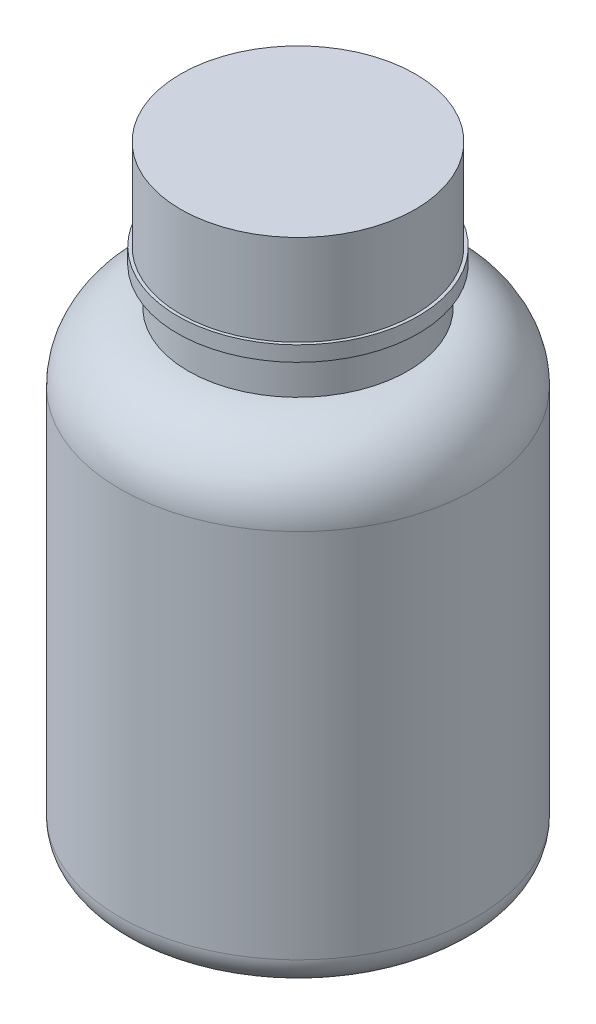
ISO-10303-21;
HEADER;
FILE_DESCRIPTION(('STEP AP214'),'2;1');
FILE_NAME('part.step','',(''),(''),'','','');
FILE_SCHEMA(('AUTOMOTIVE_DESIGN { 1 0 10303 214 1 1 1 1 }'));
ENDSEC;
DATA;
#1=APPLICATION_CONTEXT('core data for automotive mechanical design processes');
#2=APPLICATION_PROTOCOL_DEFINITION('international standard','automotive_design',2000,#1);
#3=PRODUCT_CONTEXT('',#1,'mechanical');
#4=PRODUCT('Part','Part','',(#3));
#5=PRODUCT_RELATED_PRODUCT_CATEGORY('part','',(#4));
#6=PRODUCT_DEFINITION_FORMATION('','',#4);
#7=PRODUCT_DEFINITION_CONTEXT('part definition',#1,'design');
#8=PRODUCT_DEFINITION('design','',#6,#7);
#9=PRODUCT_DEFINITION_SHAPE('','',#8);
#10=(LENGTH_UNIT() NAMED_UNIT(*) SI_UNIT(.MILLI.,.METRE.));
#11=(NAMED_UNIT(*) PLANE_ANGLE_UNIT() SI_UNIT($,.RADIAN.));
#12=(NAMED_UNIT(*) SI_UNIT($,.STERADIAN.) SOLID_ANGLE_UNIT());
#13=UNCERTAINTY_MEASURE_WITH_UNIT(LENGTH_MEASURE(1.E-05),#10,'distance_accuracy_value','');
#14=(GEOMETRIC_REPRESENTATION_CONTEXT(3) GLOBAL_UNCERTAINTY_ASSIGNED_CONTEXT((#13)) GLOBAL_UNIT_ASSIGNED_CONTEXT((#10,
#11,#12)) REPRESENTATION_CONTEXT('',''));
#15=CARTESIAN_POINT('',(0.,0.,0.));
#16=DIRECTION('',(0.,0.,1.));
#17=DIRECTION('',(1.,0.,0.));
#18=AXIS2_PLACEMENT_3D('',#15,#16,#17);
#19=CARTESIAN_POINT('',(0.,28.,0.));
#20=DIRECTION('',(0.,-1.,0.));
#21=DIRECTION('',(0.,0.,-1.));
#22=AXIS2_PLACEMENT_3D('',#19,#20,#21);
#23=TOROIDAL_SURFACE('',#22,14.5,9.);
#24=CARTESIAN_POINT('',(0.,27.9999999999999,0.));
#25=DIRECTION('',(0.,-1.,0.));
#26=DIRECTION('',(0.,0.,-1.));
#27=AXIS2_PLACEMENT_3D('',#24,#25,#26);
#28=CIRCLE('',#27,23.5);
#29=CARTESIAN_POINT('',(0.,27.9999999999999,-23.5));
#30=VERTEX_POINT('',#29);
#31=EDGE_CURVE('E66',#30,#30,#28,.T.);
#32=ORIENTED_EDGE('',*,*,#31,.F.);
#33=EDGE_LOOP('',(#32));
#34=FACE_BOUND('',#33,.T.);
#35=CARTESIAN_POINT('',(0.,37.,0.));
#36=DIRECTION('',(0.,-1.,0.));
#37=DIRECTION('',(0.,0.,-1.));
#38=AXIS2_PLACEMENT_3D('',#35,#36,#37);
#39=CIRCLE('',#38,14.4999999999999);
#40=CARTESIAN_POINT('',(0.,37.,-14.4999999999999));
#41=VERTEX_POINT('',#40);
#42=EDGE_CURVE('E10',#41,#41,#39,.T.);
#43=ORIENTED_EDGE('',*,*,#42,.T.);
#44=EDGE_LOOP('',(#43));
#45=FACE_BOUND('',#44,.T.);
#46=ADVANCED_FACE('F35',(#34,#45),#23,.T.);
#47=CARTESIAN_POINT('',(0.,0.,0.));
#48=DIRECTION('',(0.,-1.,0.));
#49=DIRECTION('',(0.,0.,-1.));
#50=AXIS2_PLACEMENT_3D('',#47,#48,#49);
#51=CYLINDRICAL_SURFACE('',#50,14.4999999999999);
#52=ORIENTED_EDGE('',*,*,#42,.F.);
#53=EDGE_LOOP('',(#52));
#54=FACE_BOUND('',#53,.T.);
#55=CARTESIAN_POINT('',(0.,42.,0.));
#56=DIRECTION('',(0.,-1.,0.));
#57=DIRECTION('',(0.,0.,-1.));
#58=AXIS2_PLACEMENT_3D('',#55,#56,#57);
#59=CIRCLE('',#58,14.4999999999999);
#60=CARTESIAN_POINT('',(0.,42.,-14.4999999999999));
#61=VERTEX_POINT('',#60);
#62=EDGE_CURVE('E41',#61,#61,#59,.T.);
#63=ORIENTED_EDGE('',*,*,#62,.T.);
#64=EDGE_LOOP('',(#63));
#65=FACE_BOUND('',#64,.T.);
#66=ADVANCED_FACE('F74',(#54,#65),#51,.T.);
#67=CARTESIAN_POINT('',(-2.06832443537463E-13,42.,0.));
#68=DIRECTION('',(0.,1.,0.));
#69=DIRECTION('',(0.,0.,1.));
#70=AXIS2_PLACEMENT_3D('',#67,#68,#69);
#71=PLANE('',#70);
#72=ORIENTED_EDGE('',*,*,#62,.F.);
#73=EDGE_LOOP('',(#72));
#74=FACE_BOUND('',#73,.T.);
#75=CARTESIAN_POINT('',(0.,42.,0.));
#76=DIRECTION('',(0.,-1.,0.));
#77=DIRECTION('',(0.,0.,-1.));
#78=AXIS2_PLACEMENT_3D('',#75,#76,#77);
#79=CIRCLE('',#78,15.909032059863);
#80=CARTESIAN_POINT('',(0.,42.,-15.909032059863));
#81=VERTEX_POINT('',#80);
#82=EDGE_CURVE('E45',#81,#81,#79,.T.);
#83=ORIENTED_EDGE('',*,*,#82,.T.);
#84=EDGE_LOOP('',(#83));
#85=FACE_BOUND('',#84,.T.);
#86=ADVANCED_FACE('F78',(#74,#85),#71,.F.);
#87=CARTESIAN_POINT('',(0.,0.,0.));
#88=DIRECTION('',(0.,-1.,0.));
#89=DIRECTION('',(0.,0.,-1.));
#90=AXIS2_PLACEMENT_3D('',#87,#88,#89);
#91=CYLINDRICAL_SURFACE('',#90,15.909032059863);
#92=ORIENTED_EDGE('',*,*,#82,.F.);
#93=EDGE_LOOP('',(#92));
#94=FACE_BOUND('',#93,.T.);
#95=CARTESIAN_POINT('',(0.,44.,0.));
#96=DIRECTION('',(0.,-1.,0.));
#97=DIRECTION('',(0.,0.,-1.));
#98=AXIS2_PLACEMENT_3D('',#95,#96,#97);
#99=CIRCLE('',#98,15.909032059863);
#100=CARTESIAN_POINT('',(0.,44.,-15.909032059863));
#101=VERTEX_POINT('',#100);
#102=EDGE_CURVE('E49',#101,#101,#99,.T.);
#103=ORIENTED_EDGE('',*,*,#102,.T.);
#104=EDGE_LOOP('',(#103));
#105=FACE_BOUND('',#104,.T.);
#106=ADVANCED_FACE('F83',(#94,#105),#91,.T.);
#107=CARTESIAN_POINT('',(0.,44.,0.));
#108=DIRECTION('',(0.,1.,0.));
#109=DIRECTION('',(0.,0.,1.));
#110=AXIS2_PLACEMENT_3D('',#107,#108,#109);
#111=PLANE('',#110);
#112=CARTESIAN_POINT('',(0.,44.,0.));
#113=DIRECTION('',(0.,-1.,0.));
#114=DIRECTION('',(0.,0.,-1.));
#115=AXIS2_PLACEMENT_3D('',#112,#113,#114);
#116=CIRCLE('',#115,15.5);
#117=CARTESIAN_POINT('',(0.,44.,-15.5));
#118=VERTEX_POINT('',#117);
#119=EDGE_CURVE('E54',#118,#118,#116,.T.);
#120=ORIENTED_EDGE('',*,*,#119,.T.);
#121=EDGE_LOOP('',(#120));
#122=FACE_BOUND('',#121,.T.);
#123=ORIENTED_EDGE('',*,*,#102,.F.);
#124=EDGE_LOOP('',(#123));
#125=FACE_BOUND('',#124,.T.);
#126=ADVANCED_FACE('F89',(#122,#125),#111,.T.);
#127=CARTESIAN_POINT('',(0.,0.,0.));
#128=DIRECTION('',(0.,-1.,0.));
#129=DIRECTION('',(0.,0.,-1.));
#130=AXIS2_PLACEMENT_3D('',#127,#128,#129);
#131=CYLINDRICAL_SURFACE('',#130,15.5);
#132=CARTESIAN_POINT('',(0.,56.,0.));
#133=DIRECTION('',(0.,-1.,0.));
#134=DIRECTION('',(0.,0.,-1.));
#135=AXIS2_PLACEMENT_3D('',#132,#133,#134);
#136=CIRCLE('',#135,15.5);
#137=CARTESIAN_POINT('',(0.,56.,-15.5));
#138=VERTEX_POINT('',#137);
#139=EDGE_CURVE('E57',#138,#138,#136,.T.);
#140=ORIENTED_EDGE('',*,*,#139,.T.);
#141=EDGE_LOOP('',(#140));
#142=FACE_BOUND('',#141,.T.);
#143=ORIENTED_EDGE('',*,*,#119,.F.);
#144=EDGE_LOOP('',(#143));
#145=FACE_BOUND('',#144,.T.);
#146=ADVANCED_FACE('F93',(#142,#145),#131,.T.);
#147=CARTESIAN_POINT('',(0.,56.,0.));
#148=DIRECTION('',(0.,-1.,0.));
#149=DIRECTION('',(0.,0.,-1.));
#150=AXIS2_PLACEMENT_3D('',#147,#148,#149);
#151=PLANE('',#150);
#152=ORIENTED_EDGE('',*,*,#139,.F.);
#153=EDGE_LOOP('',(#152));
#154=FACE_BOUND('',#153,.T.);
#155=ADVANCED_FACE('F97',(#154),#151,.F.);
#156=CARTESIAN_POINT('',(0.,-25.,0.));
#157=DIRECTION('',(0.,-1.,0.));
#158=DIRECTION('',(0.,0.,-1.));
#159=AXIS2_PLACEMENT_3D('',#156,#157,#158);
#160=PLANE('',#159);
#161=CARTESIAN_POINT('',(0.,-25.,0.));
#162=DIRECTION('',(0.,-1.,0.));
#163=DIRECTION('',(0.,0.,-1.));
#164=AXIS2_PLACEMENT_3D('',#161,#162,#163);
#165=CIRCLE('',#164,19.5);
#166=CARTESIAN_POINT('',(0.,-25.,-19.5));
#167=VERTEX_POINT('',#166);
#168=EDGE_CURVE('E60',#167,#167,#165,.T.);
#169=ORIENTED_EDGE('',*,*,#168,.T.);
#170=EDGE_LOOP('',(#169));
#171=FACE_BOUND('',#170,.T.);
#172=ADVANCED_FACE('F101',(#171),#160,.T.);
#173=CARTESIAN_POINT('',(0.,-21.,0.));
#174=DIRECTION('',(0.,-1.,0.));
#175=DIRECTION('',(0.,0.,-1.));
#176=AXIS2_PLACEMENT_3D('',#173,#174,#175);
#177=TOROIDAL_SURFACE('',#176,19.5,4.);
#178=CARTESIAN_POINT('',(0.,-21.,0.));
#179=DIRECTION('',(0.,-1.,0.));
#180=DIRECTION('',(0.,0.,-1.));
#181=AXIS2_PLACEMENT_3D('',#178,#179,#180);
#182=CIRCLE('',#181,23.5);
#183=CARTESIAN_POINT('',(0.,-21.,-23.5));
#184=VERTEX_POINT('',#183);
#185=EDGE_CURVE('E63',#184,#184,#182,.T.);
#186=ORIENTED_EDGE('',*,*,#185,.T.);
#187=EDGE_LOOP('',(#186));
#188=FACE_BOUND('',#187,.T.);
#189=ORIENTED_EDGE('',*,*,#168,.F.);
#190=EDGE_LOOP('',(#189));
#191=FACE_BOUND('',#190,.T.);
#192=ADVANCED_FACE('F105',(#188,#191),#177,.T.);
#193=CARTESIAN_POINT('',(0.,0.,0.));
#194=DIRECTION('',(0.,-1.,0.));
#195=DIRECTION('',(0.,0.,-1.));
#196=AXIS2_PLACEMENT_3D('',#193,#194,#195);
#197=CYLINDRICAL_SURFACE('',#196,23.5);
#198=ORIENTED_EDGE('',*,*,#31,.T.);
#199=EDGE_LOOP('',(#198));
#200=FACE_BOUND('',#199,.T.);
#201=ORIENTED_EDGE('',*,*,#185,.F.);
#202=EDGE_LOOP('',(#201));
#203=FACE_BOUND('',#202,.T.);
#204=ADVANCED_FACE('F70',(#200,#203),#197,.T.);
#205=CLOSED_SHELL('',(#46,#66,#86,#106,#126,#146,#155,#172,#192,#204));
#206=MANIFOLD_SOLID_BREP('B2',#205);
#207=ADVANCED_BREP_SHAPE_REPRESENTATION('',(#18,#206),#14);
#208=SHAPE_DEFINITION_REPRESENTATION(#9,#207);
ENDSEC;
END-ISO-10303-21;
